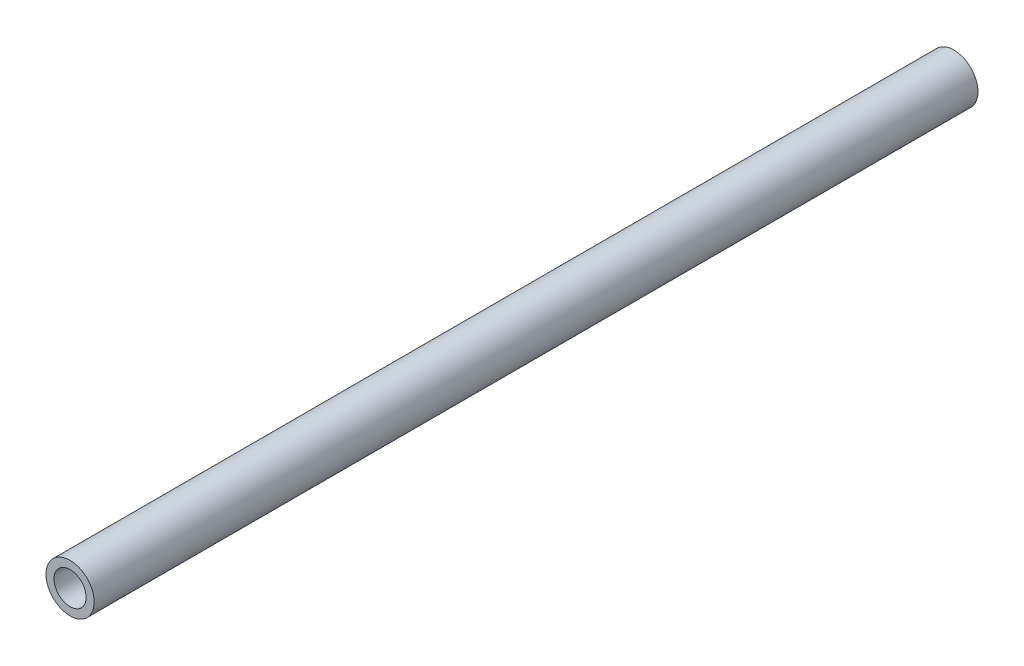
ISO-10303-21;
HEADER;
FILE_DESCRIPTION(('STEP AP214'),'2;1');
FILE_NAME('part.step','',(''),(''),'','','');
FILE_SCHEMA(('AUTOMOTIVE_DESIGN { 1 0 10303 214 1 1 1 1 }'));
ENDSEC;
DATA;
#1=APPLICATION_CONTEXT('core data for automotive mechanical design processes');
#2=APPLICATION_PROTOCOL_DEFINITION('international standard','automotive_design',2000,#1);
#3=PRODUCT_CONTEXT('',#1,'mechanical');
#4=PRODUCT('Part','Part','',(#3));
#5=PRODUCT_RELATED_PRODUCT_CATEGORY('part','',(#4));
#6=PRODUCT_DEFINITION_FORMATION('','',#4);
#7=PRODUCT_DEFINITION_CONTEXT('part definition',#1,'design');
#8=PRODUCT_DEFINITION('design','',#6,#7);
#9=PRODUCT_DEFINITION_SHAPE('','',#8);
#10=(LENGTH_UNIT() NAMED_UNIT(*) SI_UNIT(.MILLI.,.METRE.));
#11=(NAMED_UNIT(*) PLANE_ANGLE_UNIT() SI_UNIT($,.RADIAN.));
#12=(NAMED_UNIT(*) SI_UNIT($,.STERADIAN.) SOLID_ANGLE_UNIT());
#13=UNCERTAINTY_MEASURE_WITH_UNIT(LENGTH_MEASURE(1.E-05),#10,'distance_accuracy_value','');
#14=(GEOMETRIC_REPRESENTATION_CONTEXT(3) GLOBAL_UNCERTAINTY_ASSIGNED_CONTEXT((#13)) GLOBAL_UNIT_ASSIGNED_CONTEXT((#10,
#11,#12)) REPRESENTATION_CONTEXT('',''));
#15=CARTESIAN_POINT('',(0.,0.,0.));
#16=DIRECTION('',(0.,0.,1.));
#17=DIRECTION('',(1.,0.,0.));
#18=AXIS2_PLACEMENT_3D('',#15,#16,#17);
#19=CARTESIAN_POINT('',(0.,0.,110.));
#20=DIRECTION('',(0.,0.,1.));
#21=DIRECTION('',(1.,0.,0.));
#22=AXIS2_PLACEMENT_3D('',#19,#20,#21);
#23=PLANE('',#22);
#24=CARTESIAN_POINT('',(0.,0.,110.));
#25=DIRECTION('',(0.,0.,1.));
#26=DIRECTION('',(1.,0.,0.));
#27=AXIS2_PLACEMENT_3D('',#24,#25,#26);
#28=CIRCLE('',#27,6.);
#29=CARTESIAN_POINT('',(6.,0.,110.));
#30=VERTEX_POINT('',#29);
#31=EDGE_CURVE('E10',#30,#30,#28,.T.);
#32=ORIENTED_EDGE('',*,*,#31,.T.);
#33=EDGE_LOOP('',(#32));
#34=FACE_BOUND('',#33,.T.);
#35=CARTESIAN_POINT('',(0.,0.,110.));
#36=DIRECTION('',(0.,0.,1.));
#37=DIRECTION('',(1.,0.,0.));
#38=AXIS2_PLACEMENT_3D('',#35,#36,#37);
#39=CIRCLE('',#38,4.);
#40=CARTESIAN_POINT('',(4.,0.,110.));
#41=VERTEX_POINT('',#40);
#42=EDGE_CURVE('E56',#41,#41,#39,.T.);
#43=ORIENTED_EDGE('',*,*,#42,.F.);
#44=EDGE_LOOP('',(#43));
#45=FACE_BOUND('',#44,.T.);
#46=ADVANCED_FACE('F43',(#34,#45),#23,.T.);
#47=CARTESIAN_POINT('',(0.,0.,-110.));
#48=DIRECTION('',(0.,0.,1.));
#49=DIRECTION('',(1.,0.,0.));
#50=AXIS2_PLACEMENT_3D('',#47,#48,#49);
#51=PLANE('',#50);
#52=CARTESIAN_POINT('',(0.,0.,-110.));
#53=DIRECTION('',(0.,0.,1.));
#54=DIRECTION('',(1.,0.,0.));
#55=AXIS2_PLACEMENT_3D('',#52,#53,#54);
#56=CIRCLE('',#55,6.);
#57=CARTESIAN_POINT('',(6.,0.,-110.));
#58=VERTEX_POINT('',#57);
#59=EDGE_CURVE('E47',#58,#58,#56,.T.);
#60=ORIENTED_EDGE('',*,*,#59,.F.);
#61=EDGE_LOOP('',(#60));
#62=FACE_BOUND('',#61,.T.);
#63=CARTESIAN_POINT('',(0.,0.,-110.));
#64=DIRECTION('',(0.,0.,1.));
#65=DIRECTION('',(1.,0.,0.));
#66=AXIS2_PLACEMENT_3D('',#63,#64,#65);
#67=CIRCLE('',#66,4.);
#68=CARTESIAN_POINT('',(4.,0.,-110.));
#69=VERTEX_POINT('',#68);
#70=EDGE_CURVE('E58',#69,#69,#67,.T.);
#71=ORIENTED_EDGE('',*,*,#70,.T.);
#72=EDGE_LOOP('',(#71));
#73=FACE_BOUND('',#72,.T.);
#74=ADVANCED_FACE('F70',(#62,#73),#51,.F.);
#75=CARTESIAN_POINT('',(0.,0.,110.));
#76=DIRECTION('',(0.,0.,-1.));
#77=DIRECTION('',(-1.,0.,0.));
#78=AXIS2_PLACEMENT_3D('',#75,#76,#77);
#79=CYLINDRICAL_SURFACE('',#78,6.);
#80=ORIENTED_EDGE('',*,*,#31,.F.);
#81=EDGE_LOOP('',(#80));
#82=FACE_BOUND('',#81,.T.);
#83=ORIENTED_EDGE('',*,*,#59,.T.);
#84=EDGE_LOOP('',(#83));
#85=FACE_BOUND('',#84,.T.);
#86=ADVANCED_FACE('F45',(#82,#85),#79,.T.);
#87=CARTESIAN_POINT('',(0.,0.,110.));
#88=DIRECTION('',(0.,0.,-1.));
#89=DIRECTION('',(-1.,0.,0.));
#90=AXIS2_PLACEMENT_3D('',#87,#88,#89);
#91=CYLINDRICAL_SURFACE('',#90,4.);
#92=ORIENTED_EDGE('',*,*,#42,.T.);
#93=EDGE_LOOP('',(#92));
#94=FACE_BOUND('',#93,.T.);
#95=ORIENTED_EDGE('',*,*,#70,.F.);
#96=EDGE_LOOP('',(#95));
#97=FACE_BOUND('',#96,.T.);
#98=ADVANCED_FACE('F66',(#94,#97),#91,.F.);
#99=CLOSED_SHELL('',(#46,#74,#86,#98));
#100=MANIFOLD_SOLID_BREP('B2',#99);
#101=ADVANCED_BREP_SHAPE_REPRESENTATION('',(#18,#100),#14);
#102=SHAPE_DEFINITION_REPRESENTATION(#9,#101);
ENDSEC;
END-ISO-10303-21;
